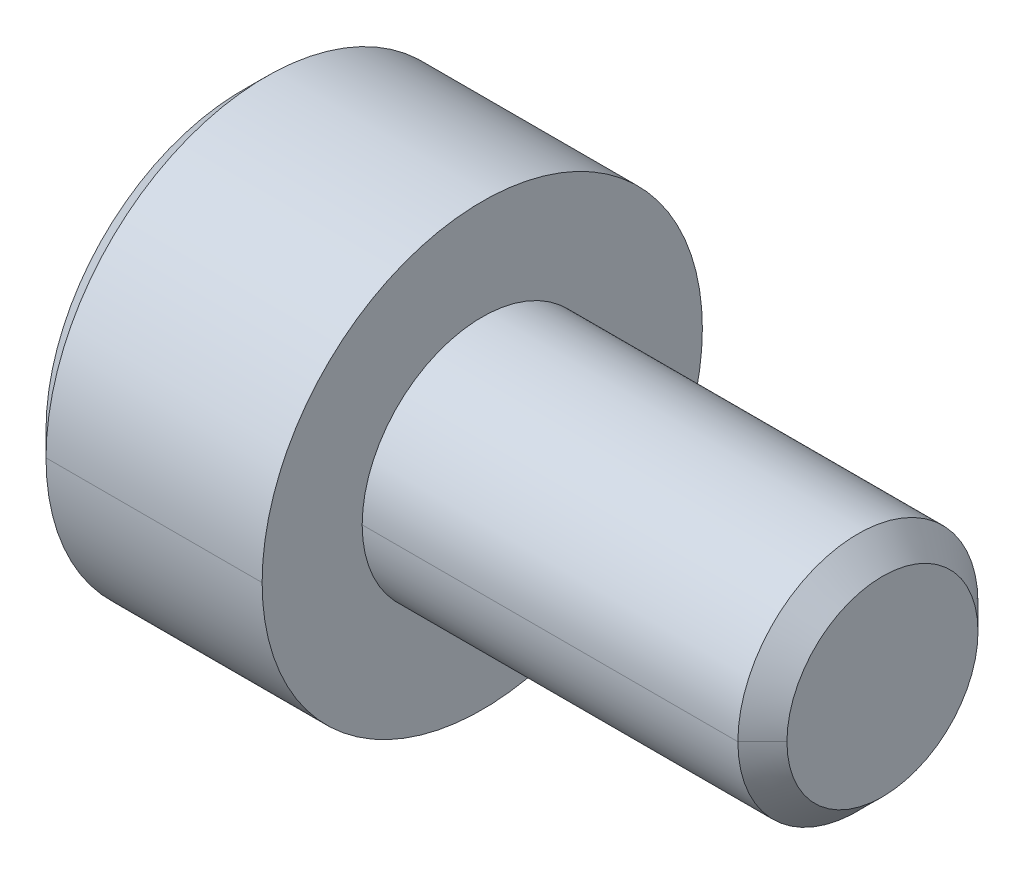
ISO-10303-21;
HEADER;
FILE_DESCRIPTION(('STEP AP214'),'2;1');
FILE_NAME('part.step','',(''),(''),'','','');
FILE_SCHEMA(('AUTOMOTIVE_DESIGN { 1 0 10303 214 1 1 1 1 }'));
ENDSEC;
DATA;
#1=APPLICATION_CONTEXT('core data for automotive mechanical design processes');
#2=APPLICATION_PROTOCOL_DEFINITION('international standard','automotive_design',2000,#1);
#3=PRODUCT_CONTEXT('',#1,'mechanical');
#4=PRODUCT('Part','Part','',(#3));
#5=PRODUCT_RELATED_PRODUCT_CATEGORY('part','',(#4));
#6=PRODUCT_DEFINITION_FORMATION('','',#4);
#7=PRODUCT_DEFINITION_CONTEXT('part definition',#1,'design');
#8=PRODUCT_DEFINITION('design','',#6,#7);
#9=PRODUCT_DEFINITION_SHAPE('','',#8);
#10=(LENGTH_UNIT() NAMED_UNIT(*) SI_UNIT(.MILLI.,.METRE.));
#11=(NAMED_UNIT(*) PLANE_ANGLE_UNIT() SI_UNIT($,.RADIAN.));
#12=(NAMED_UNIT(*) SI_UNIT($,.STERADIAN.) SOLID_ANGLE_UNIT());
#13=UNCERTAINTY_MEASURE_WITH_UNIT(LENGTH_MEASURE(1.E-05),#10,'distance_accuracy_value','');
#14=(GEOMETRIC_REPRESENTATION_CONTEXT(3) GLOBAL_UNCERTAINTY_ASSIGNED_CONTEXT((#13)) GLOBAL_UNIT_ASSIGNED_CONTEXT((#10,
#11,#12)) REPRESENTATION_CONTEXT('',''));
#15=CARTESIAN_POINT('',(0.,0.,0.));
#16=DIRECTION('',(0.,0.,1.));
#17=DIRECTION('',(1.,0.,0.));
#18=AXIS2_PLACEMENT_3D('',#15,#16,#17);
#19=CARTESIAN_POINT('',(-3.,0.,0.));
#20=DIRECTION('',(1.,0.,0.));
#21=DIRECTION('',(0.,0.,-1.));
#22=AXIS2_PLACEMENT_3D('',#19,#20,#21);
#23=PLANE('',#22);
#24=CARTESIAN_POINT('',(-3.,0.,0.));
#25=DIRECTION('',(1.,0.,0.));
#26=DIRECTION('',(0.,0.,-1.));
#27=AXIS2_PLACEMENT_3D('',#24,#25,#26);
#28=CIRCLE('',#27,2.45);
#29=CARTESIAN_POINT('',(-3.,0.,2.45));
#30=VERTEX_POINT('',#29);
#31=CARTESIAN_POINT('',(-3.,0.,-2.45));
#32=VERTEX_POINT('',#31);
#33=EDGE_CURVE('E11',#30,#32,#28,.T.);
#34=ORIENTED_EDGE('',*,*,#33,.F.);
#35=CARTESIAN_POINT('',(-3.,0.,0.));
#36=DIRECTION('',(1.,0.,0.));
#37=DIRECTION('',(0.,0.,-1.));
#38=AXIS2_PLACEMENT_3D('',#35,#36,#37);
#39=CIRCLE('',#38,2.45);
#40=EDGE_CURVE('E24',#32,#30,#39,.T.);
#41=ORIENTED_EDGE('',*,*,#40,.F.);
#42=EDGE_LOOP('',(#34,#41));
#43=FACE_BOUND('',#42,.T.);
#44=DIRECTION('',(0.,0.50000000000002,-0.866025403784427));
#45=VECTOR('',#44,1.);
#46=CARTESIAN_POINT('',(-3.,-1.4433756729741,0.));
#47=LINE('',#46,#45);
#48=CARTESIAN_POINT('',(-3.,-1.4433756729741,0.));
#49=VERTEX_POINT('',#48);
#50=CARTESIAN_POINT('',(-3.,-0.72168783648703,-1.25));
#51=VERTEX_POINT('',#50);
#52=EDGE_CURVE('E352',#49,#51,#47,.T.);
#53=ORIENTED_EDGE('',*,*,#52,.T.);
#54=DIRECTION('',(0.,1.,0.));
#55=VECTOR('',#54,1.);
#56=CARTESIAN_POINT('',(-3.,-0.72168783648703,-1.25));
#57=LINE('',#56,#55);
#58=CARTESIAN_POINT('',(-3.,0.72168783648703,-1.25));
#59=VERTEX_POINT('',#58);
#60=EDGE_CURVE('E348',#51,#59,#57,.T.);
#61=ORIENTED_EDGE('',*,*,#60,.T.);
#62=DIRECTION('',(0.,0.50000000000002,0.866025403784427));
#63=VECTOR('',#62,1.);
#64=CARTESIAN_POINT('',(-3.,0.72168783648703,-1.25));
#65=LINE('',#64,#63);
#66=CARTESIAN_POINT('',(-3.,1.4433756729741,0.));
#67=VERTEX_POINT('',#66);
#68=EDGE_CURVE('E344',#59,#67,#65,.T.);
#69=ORIENTED_EDGE('',*,*,#68,.T.);
#70=DIRECTION('',(0.,-0.50000000000002,0.866025403784427));
#71=VECTOR('',#70,1.);
#72=CARTESIAN_POINT('',(-3.,1.4433756729741,0.));
#73=LINE('',#72,#71);
#74=CARTESIAN_POINT('',(-3.,0.72168783648703,1.25));
#75=VERTEX_POINT('',#74);
#76=EDGE_CURVE('E340',#67,#75,#73,.T.);
#77=ORIENTED_EDGE('',*,*,#76,.T.);
#78=DIRECTION('',(0.,-1.,0.));
#79=VECTOR('',#78,1.);
#80=CARTESIAN_POINT('',(-3.,0.72168783648703,1.25));
#81=LINE('',#80,#79);
#82=CARTESIAN_POINT('',(-3.,-0.72168783648703,1.25));
#83=VERTEX_POINT('',#82);
#84=EDGE_CURVE('E336',#75,#83,#81,.T.);
#85=ORIENTED_EDGE('',*,*,#84,.T.);
#86=DIRECTION('',(0.,-0.50000000000002,-0.866025403784427));
#87=VECTOR('',#86,1.);
#88=CARTESIAN_POINT('',(-3.,-0.72168783648703,1.25));
#89=LINE('',#88,#87);
#90=EDGE_CURVE('E332',#83,#49,#89,.T.);
#91=ORIENTED_EDGE('',*,*,#90,.T.);
#92=EDGE_LOOP('',(#53,#61,#69,#77,#85,#91));
#93=FACE_BOUND('',#92,.T.);
#94=ADVANCED_FACE('F16',(#43,#93),#23,.F.);
#95=CARTESIAN_POINT('',(-1.5,-0.72168783648703,1.25));
#96=DIRECTION('',(0.,0.866025403784427,-0.50000000000002));
#97=DIRECTION('',(0.,0.50000000000002,0.866025403784427));
#98=AXIS2_PLACEMENT_3D('',#95,#96,#97);
#99=PLANE('',#98);
#100=ORIENTED_EDGE('',*,*,#90,.F.);
#101=DIRECTION('',(-1.,0.,0.));
#102=VECTOR('',#101,1.);
#103=CARTESIAN_POINT('',(-1.5,-0.72168783648703,1.25));
#104=LINE('',#103,#102);
#105=CARTESIAN_POINT('',(-1.5,-0.72168783648703,1.25));
#106=VERTEX_POINT('',#105);
#107=EDGE_CURVE('E327',#106,#83,#104,.T.);
#108=ORIENTED_EDGE('',*,*,#107,.F.);
#109=DIRECTION('',(0.,-0.50000000000002,-0.866025403784427));
#110=VECTOR('',#109,1.);
#111=CARTESIAN_POINT('',(-1.5,-0.72168783648703,1.25));
#112=LINE('',#111,#110);
#113=CARTESIAN_POINT('',(-1.5,-1.08253175473055,0.625000000000032));
#114=VERTEX_POINT('',#113);
#115=EDGE_CURVE('E323',#106,#114,#112,.T.);
#116=ORIENTED_EDGE('',*,*,#115,.T.);
#117=DIRECTION('',(0.,-0.50000000000002,-0.866025403784427));
#118=VECTOR('',#117,1.);
#119=CARTESIAN_POINT('',(-1.5,-0.72168783648703,1.25));
#120=LINE('',#119,#118);
#121=CARTESIAN_POINT('',(-1.5,-1.4433756729741,0.));
#122=VERTEX_POINT('',#121);
#123=EDGE_CURVE('E319',#114,#122,#120,.T.);
#124=ORIENTED_EDGE('',*,*,#123,.T.);
#125=DIRECTION('',(-1.,0.,0.));
#126=VECTOR('',#125,1.);
#127=CARTESIAN_POINT('',(-1.5,-1.4433756729741,0.));
#128=LINE('',#127,#126);
#129=EDGE_CURVE('E314',#122,#49,#128,.T.);
#130=ORIENTED_EDGE('',*,*,#129,.T.);
#131=EDGE_LOOP('',(#100,#108,#116,#124,#130));
#132=FACE_BOUND('',#131,.T.);
#133=ADVANCED_FACE('F386',(#132),#99,.T.);
#134=CARTESIAN_POINT('',(-1.5,-1.4433756729741,0.));
#135=DIRECTION('',(0.,0.866025403784427,0.50000000000002));
#136=DIRECTION('',(0.,-0.50000000000002,0.866025403784427));
#137=AXIS2_PLACEMENT_3D('',#134,#135,#136);
#138=PLANE('',#137);
#139=ORIENTED_EDGE('',*,*,#52,.F.);
#140=ORIENTED_EDGE('',*,*,#129,.F.);
#141=DIRECTION('',(0.,0.50000000000002,-0.866025403784427));
#142=VECTOR('',#141,1.);
#143=CARTESIAN_POINT('',(-1.5,-1.4433756729741,0.));
#144=LINE('',#143,#142);
#145=CARTESIAN_POINT('',(-1.5,-1.08253175473053,-0.625000000000024));
#146=VERTEX_POINT('',#145);
#147=EDGE_CURVE('E310',#122,#146,#144,.T.);
#148=ORIENTED_EDGE('',*,*,#147,.T.);
#149=DIRECTION('',(0.,0.50000000000002,-0.866025403784427));
#150=VECTOR('',#149,1.);
#151=CARTESIAN_POINT('',(-1.5,-1.4433756729741,0.));
#152=LINE('',#151,#150);
#153=CARTESIAN_POINT('',(-1.5,-0.72168783648703,-1.25));
#154=VERTEX_POINT('',#153);
#155=EDGE_CURVE('E306',#146,#154,#152,.T.);
#156=ORIENTED_EDGE('',*,*,#155,.T.);
#157=DIRECTION('',(-1.,0.,0.));
#158=VECTOR('',#157,1.);
#159=CARTESIAN_POINT('',(-1.5,-0.72168783648703,-1.25));
#160=LINE('',#159,#158);
#161=EDGE_CURVE('E301',#154,#51,#160,.T.);
#162=ORIENTED_EDGE('',*,*,#161,.T.);
#163=EDGE_LOOP('',(#139,#140,#148,#156,#162));
#164=FACE_BOUND('',#163,.T.);
#165=ADVANCED_FACE('F390',(#164),#138,.T.);
#166=CARTESIAN_POINT('',(-1.5,-0.72168783648703,-1.25));
#167=DIRECTION('',(0.,0.,1.));
#168=DIRECTION('',(1.,0.,0.));
#169=AXIS2_PLACEMENT_3D('',#166,#167,#168);
#170=PLANE('',#169);
#171=ORIENTED_EDGE('',*,*,#60,.F.);
#172=ORIENTED_EDGE('',*,*,#161,.F.);
#173=DIRECTION('',(0.,1.,0.));
#174=VECTOR('',#173,1.);
#175=CARTESIAN_POINT('',(-1.5,-0.72168783648703,-1.25));
#176=LINE('',#175,#174);
#177=CARTESIAN_POINT('',(-1.5,0.,-1.25));
#178=VERTEX_POINT('',#177);
#179=EDGE_CURVE('E297',#154,#178,#176,.T.);
#180=ORIENTED_EDGE('',*,*,#179,.T.);
#181=DIRECTION('',(0.,1.,0.));
#182=VECTOR('',#181,1.);
#183=CARTESIAN_POINT('',(-1.5,-0.72168783648703,-1.25));
#184=LINE('',#183,#182);
#185=CARTESIAN_POINT('',(-1.5,0.72168783648703,-1.25));
#186=VERTEX_POINT('',#185);
#187=EDGE_CURVE('E293',#178,#186,#184,.T.);
#188=ORIENTED_EDGE('',*,*,#187,.T.);
#189=DIRECTION('',(-1.,0.,0.));
#190=VECTOR('',#189,1.);
#191=CARTESIAN_POINT('',(-1.5,0.72168783648703,-1.25));
#192=LINE('',#191,#190);
#193=EDGE_CURVE('E288',#186,#59,#192,.T.);
#194=ORIENTED_EDGE('',*,*,#193,.T.);
#195=EDGE_LOOP('',(#171,#172,#180,#188,#194));
#196=FACE_BOUND('',#195,.T.);
#197=ADVANCED_FACE('F402',(#196),#170,.T.);
#198=CARTESIAN_POINT('',(-1.5,0.72168783648703,-1.25));
#199=DIRECTION('',(0.,-0.866025403784427,0.50000000000002));
#200=DIRECTION('',(0.,-0.50000000000002,-0.866025403784427));
#201=AXIS2_PLACEMENT_3D('',#198,#199,#200);
#202=PLANE('',#201);
#203=ORIENTED_EDGE('',*,*,#68,.F.);
#204=ORIENTED_EDGE('',*,*,#193,.F.);
#205=DIRECTION('',(0.,0.50000000000002,0.866025403784427));
#206=VECTOR('',#205,1.);
#207=CARTESIAN_POINT('',(-1.5,0.72168783648703,-1.25));
#208=LINE('',#207,#206);
#209=CARTESIAN_POINT('',(-1.5,1.08253175473055,-0.625000000000032));
#210=VERTEX_POINT('',#209);
#211=EDGE_CURVE('E284',#186,#210,#208,.T.);
#212=ORIENTED_EDGE('',*,*,#211,.T.);
#213=DIRECTION('',(0.,0.50000000000002,0.866025403784427));
#214=VECTOR('',#213,1.);
#215=CARTESIAN_POINT('',(-1.5,0.72168783648703,-1.25));
#216=LINE('',#215,#214);
#217=CARTESIAN_POINT('',(-1.5,1.4433756729741,0.));
#218=VERTEX_POINT('',#217);
#219=EDGE_CURVE('E280',#210,#218,#216,.T.);
#220=ORIENTED_EDGE('',*,*,#219,.T.);
#221=DIRECTION('',(-1.,0.,0.));
#222=VECTOR('',#221,1.);
#223=CARTESIAN_POINT('',(-1.5,1.4433756729741,0.));
#224=LINE('',#223,#222);
#225=EDGE_CURVE('E275',#218,#67,#224,.T.);
#226=ORIENTED_EDGE('',*,*,#225,.T.);
#227=EDGE_LOOP('',(#203,#204,#212,#220,#226));
#228=FACE_BOUND('',#227,.T.);
#229=ADVANCED_FACE('F408',(#228),#202,.T.);
#230=CARTESIAN_POINT('',(-1.5,1.4433756729741,0.));
#231=DIRECTION('',(0.,-0.866025403784427,-0.50000000000002));
#232=DIRECTION('',(0.,0.50000000000002,-0.866025403784427));
#233=AXIS2_PLACEMENT_3D('',#230,#231,#232);
#234=PLANE('',#233);
#235=ORIENTED_EDGE('',*,*,#76,.F.);
#236=ORIENTED_EDGE('',*,*,#225,.F.);
#237=DIRECTION('',(0.,-0.50000000000002,0.866025403784427));
#238=VECTOR('',#237,1.);
#239=CARTESIAN_POINT('',(-1.5,1.4433756729741,0.));
#240=LINE('',#239,#238);
#241=CARTESIAN_POINT('',(-1.5,1.08253175473055,0.625000000000032));
#242=VERTEX_POINT('',#241);
#243=EDGE_CURVE('E271',#218,#242,#240,.T.);
#244=ORIENTED_EDGE('',*,*,#243,.T.);
#245=DIRECTION('',(0.,-0.50000000000002,0.866025403784427));
#246=VECTOR('',#245,1.);
#247=CARTESIAN_POINT('',(-1.5,1.4433756729741,0.));
#248=LINE('',#247,#246);
#249=CARTESIAN_POINT('',(-1.5,0.72168783648703,1.25));
#250=VERTEX_POINT('',#249);
#251=EDGE_CURVE('E267',#242,#250,#248,.T.);
#252=ORIENTED_EDGE('',*,*,#251,.T.);
#253=DIRECTION('',(-1.,0.,0.));
#254=VECTOR('',#253,1.);
#255=CARTESIAN_POINT('',(-1.5,0.72168783648703,1.25));
#256=LINE('',#255,#254);
#257=EDGE_CURVE('E262',#250,#75,#256,.T.);
#258=ORIENTED_EDGE('',*,*,#257,.T.);
#259=EDGE_LOOP('',(#235,#236,#244,#252,#258));
#260=FACE_BOUND('',#259,.T.);
#261=ADVANCED_FACE('F414',(#260),#234,.T.);
#262=CARTESIAN_POINT('',(-1.5,0.72168783648703,1.25));
#263=DIRECTION('',(0.,0.,-1.));
#264=DIRECTION('',(-1.,0.,0.));
#265=AXIS2_PLACEMENT_3D('',#262,#263,#264);
#266=PLANE('',#265);
#267=ORIENTED_EDGE('',*,*,#84,.F.);
#268=ORIENTED_EDGE('',*,*,#257,.F.);
#269=DIRECTION('',(0.,-1.,0.));
#270=VECTOR('',#269,1.);
#271=CARTESIAN_POINT('',(-1.5,0.72168783648703,1.25));
#272=LINE('',#271,#270);
#273=CARTESIAN_POINT('',(-1.5,0.,1.25));
#274=VERTEX_POINT('',#273);
#275=EDGE_CURVE('E258',#250,#274,#272,.T.);
#276=ORIENTED_EDGE('',*,*,#275,.T.);
#277=DIRECTION('',(0.,-1.,0.));
#278=VECTOR('',#277,1.);
#279=CARTESIAN_POINT('',(-1.5,0.72168783648703,1.25));
#280=LINE('',#279,#278);
#281=EDGE_CURVE('E253',#274,#106,#280,.T.);
#282=ORIENTED_EDGE('',*,*,#281,.T.);
#283=ORIENTED_EDGE('',*,*,#107,.T.);
#284=EDGE_LOOP('',(#267,#268,#276,#282,#283));
#285=FACE_BOUND('',#284,.T.);
#286=ADVANCED_FACE('F418',(#285),#266,.T.);
#287=CARTESIAN_POINT('',(-1.5,0.,0.));
#288=DIRECTION('',(1.,0.,0.));
#289=DIRECTION('',(0.,0.,-1.));
#290=AXIS2_PLACEMENT_3D('',#287,#288,#289);
#291=PLANE('',#290);
#292=CARTESIAN_POINT('',(-1.5,0.,0.));
#293=DIRECTION('',(1.,0.,0.));
#294=DIRECTION('',(0.,0.,-1.));
#295=AXIS2_PLACEMENT_3D('',#292,#293,#294);
#296=CIRCLE('',#295,1.25);
#297=EDGE_CURVE('E248',#274,#114,#296,.T.);
#298=ORIENTED_EDGE('',*,*,#297,.T.);
#299=ORIENTED_EDGE('',*,*,#115,.F.);
#300=ORIENTED_EDGE('',*,*,#281,.F.);
#301=EDGE_LOOP('',(#298,#299,#300));
#302=FACE_BOUND('',#301,.T.);
#303=ADVANCED_FACE('F459',(#302),#291,.F.);
#304=CARTESIAN_POINT('',(-1.5,0.,0.));
#305=DIRECTION('',(-1.,0.,0.));
#306=DIRECTION('',(0.,1.,0.));
#307=AXIS2_PLACEMENT_3D('',#304,#305,#306);
#308=CONICAL_SURFACE('',#307,1.25,1.30899693899575);
#309=DIRECTION('',(-0.258819045102518,0.,-0.965925826289069));
#310=VECTOR('',#309,1.);
#311=CARTESIAN_POINT('',(-1.1650635094611,0.,0.));
#312=LINE('',#311,#310);
#313=CARTESIAN_POINT('',(-1.1650635094611,0.,0.));
#314=VERTEX_POINT('',#313);
#315=EDGE_CURVE('E243',#314,#178,#312,.T.);
#316=ORIENTED_EDGE('',*,*,#315,.T.);
#317=CARTESIAN_POINT('',(-1.5,0.,0.));
#318=DIRECTION('',(1.,0.,0.));
#319=DIRECTION('',(0.,0.,-1.));
#320=AXIS2_PLACEMENT_3D('',#317,#318,#319);
#321=CIRCLE('',#320,1.25);
#322=EDGE_CURVE('E238',#146,#178,#321,.T.);
#323=ORIENTED_EDGE('',*,*,#322,.F.);
#324=CARTESIAN_POINT('',(-1.5,0.,0.));
#325=DIRECTION('',(1.,0.,0.));
#326=DIRECTION('',(0.,0.,-1.));
#327=AXIS2_PLACEMENT_3D('',#324,#325,#326);
#328=CIRCLE('',#327,1.25);
#329=EDGE_CURVE('E233',#114,#146,#328,.T.);
#330=ORIENTED_EDGE('',*,*,#329,.F.);
#331=ORIENTED_EDGE('',*,*,#297,.F.);
#332=DIRECTION('',(-0.258819045102518,0.,0.965925826289069));
#333=VECTOR('',#332,1.);
#334=CARTESIAN_POINT('',(-1.1650635094611,0.,0.));
#335=LINE('',#334,#333);
#336=EDGE_CURVE('E228',#314,#274,#335,.T.);
#337=ORIENTED_EDGE('',*,*,#336,.F.);
#338=EDGE_LOOP('',(#316,#323,#330,#331,#337));
#339=FACE_BOUND('',#338,.T.);
#340=ADVANCED_FACE('F427',(#339),#308,.F.);
#341=CARTESIAN_POINT('',(-1.5,0.,0.));
#342=DIRECTION('',(-1.,0.,0.));
#343=DIRECTION('',(0.,-1.,0.));
#344=AXIS2_PLACEMENT_3D('',#341,#342,#343);
#345=CONICAL_SURFACE('',#344,1.25,1.30899693899575);
#346=ORIENTED_EDGE('',*,*,#336,.T.);
#347=CARTESIAN_POINT('',(-1.5,0.,0.));
#348=DIRECTION('',(1.,0.,0.));
#349=DIRECTION('',(0.,0.,-1.));
#350=AXIS2_PLACEMENT_3D('',#347,#348,#349);
#351=CIRCLE('',#350,1.25);
#352=EDGE_CURVE('E223',#242,#274,#351,.T.);
#353=ORIENTED_EDGE('',*,*,#352,.F.);
#354=CARTESIAN_POINT('',(-1.5,0.,0.));
#355=DIRECTION('',(1.,0.,0.));
#356=DIRECTION('',(0.,0.,-1.));
#357=AXIS2_PLACEMENT_3D('',#354,#355,#356);
#358=CIRCLE('',#357,1.25);
#359=EDGE_CURVE('E218',#210,#242,#358,.T.);
#360=ORIENTED_EDGE('',*,*,#359,.F.);
#361=CARTESIAN_POINT('',(-1.5,0.,0.));
#362=DIRECTION('',(1.,0.,0.));
#363=DIRECTION('',(0.,0.,-1.));
#364=AXIS2_PLACEMENT_3D('',#361,#362,#363);
#365=CIRCLE('',#364,1.25);
#366=EDGE_CURVE('E213',#178,#210,#365,.T.);
#367=ORIENTED_EDGE('',*,*,#366,.F.);
#368=ORIENTED_EDGE('',*,*,#315,.F.);
#369=EDGE_LOOP('',(#346,#353,#360,#367,#368));
#370=FACE_BOUND('',#369,.T.);
#371=ADVANCED_FACE('F452',(#370),#345,.F.);
#372=CARTESIAN_POINT('',(-1.5,0.,0.));
#373=DIRECTION('',(1.,0.,0.));
#374=DIRECTION('',(0.,0.,-1.));
#375=AXIS2_PLACEMENT_3D('',#372,#373,#374);
#376=PLANE('',#375);
#377=ORIENTED_EDGE('',*,*,#366,.T.);
#378=ORIENTED_EDGE('',*,*,#211,.F.);
#379=ORIENTED_EDGE('',*,*,#187,.F.);
#380=EDGE_LOOP('',(#377,#378,#379));
#381=FACE_BOUND('',#380,.T.);
#382=ADVANCED_FACE('F448',(#381),#376,.F.);
#383=CARTESIAN_POINT('',(-1.5,0.,0.));
#384=DIRECTION('',(1.,0.,0.));
#385=DIRECTION('',(0.,0.,-1.));
#386=AXIS2_PLACEMENT_3D('',#383,#384,#385);
#387=PLANE('',#386);
#388=ORIENTED_EDGE('',*,*,#219,.F.);
#389=ORIENTED_EDGE('',*,*,#359,.T.);
#390=ORIENTED_EDGE('',*,*,#243,.F.);
#391=EDGE_LOOP('',(#388,#389,#390));
#392=FACE_BOUND('',#391,.T.);
#393=ADVANCED_FACE('F441',(#392),#387,.F.);
#394=CARTESIAN_POINT('',(-1.5,0.,0.));
#395=DIRECTION('',(1.,0.,0.));
#396=DIRECTION('',(0.,0.,-1.));
#397=AXIS2_PLACEMENT_3D('',#394,#395,#396);
#398=PLANE('',#397);
#399=ORIENTED_EDGE('',*,*,#352,.T.);
#400=ORIENTED_EDGE('',*,*,#275,.F.);
#401=ORIENTED_EDGE('',*,*,#251,.F.);
#402=EDGE_LOOP('',(#399,#400,#401));
#403=FACE_BOUND('',#402,.T.);
#404=ADVANCED_FACE('F434',(#403),#398,.F.);
#405=CARTESIAN_POINT('',(-1.5,0.,0.));
#406=DIRECTION('',(1.,0.,0.));
#407=DIRECTION('',(0.,0.,-1.));
#408=AXIS2_PLACEMENT_3D('',#405,#406,#407);
#409=PLANE('',#408);
#410=ORIENTED_EDGE('',*,*,#329,.T.);
#411=ORIENTED_EDGE('',*,*,#147,.F.);
#412=ORIENTED_EDGE('',*,*,#123,.F.);
#413=EDGE_LOOP('',(#410,#411,#412));
#414=FACE_BOUND('',#413,.T.);
#415=ADVANCED_FACE('F432',(#414),#409,.F.);
#416=CARTESIAN_POINT('',(-1.5,0.,0.));
#417=DIRECTION('',(1.,0.,0.));
#418=DIRECTION('',(0.,0.,-1.));
#419=AXIS2_PLACEMENT_3D('',#416,#417,#418);
#420=PLANE('',#419);
#421=ORIENTED_EDGE('',*,*,#322,.T.);
#422=ORIENTED_EDGE('',*,*,#179,.F.);
#423=ORIENTED_EDGE('',*,*,#155,.F.);
#424=EDGE_LOOP('',(#421,#422,#423));
#425=FACE_BOUND('',#424,.T.);
#426=ADVANCED_FACE('F431',(#425),#420,.F.);
#427=CARTESIAN_POINT('',(-3.,0.,0.));
#428=DIRECTION('',(1.,0.,0.));
#429=DIRECTION('',(0.,-1.,0.));
#430=AXIS2_PLACEMENT_3D('',#427,#428,#429);
#431=CONICAL_SURFACE('',#430,2.45,0.785398163397448);
#432=DIRECTION('',(0.707106781186548,0.,0.707106781186547));
#433=VECTOR('',#432,1.);
#434=CARTESIAN_POINT('',(-3.,0.,2.45));
#435=LINE('',#434,#433);
#436=CARTESIAN_POINT('',(-2.7,0.,2.75));
#437=VERTEX_POINT('',#436);
#438=EDGE_CURVE('E209',#30,#437,#435,.T.);
#439=ORIENTED_EDGE('',*,*,#438,.T.);
#440=CARTESIAN_POINT('',(-2.7,0.,0.));
#441=DIRECTION('',(1.,0.,0.));
#442=DIRECTION('',(0.,0.,-1.));
#443=AXIS2_PLACEMENT_3D('',#440,#441,#442);
#444=CIRCLE('',#443,2.75);
#445=CARTESIAN_POINT('',(-2.7,0.,-2.75));
#446=VERTEX_POINT('',#445);
#447=EDGE_CURVE('E204',#446,#437,#444,.T.);
#448=ORIENTED_EDGE('',*,*,#447,.F.);
#449=DIRECTION('',(0.707106781186548,0.,-0.707106781186547));
#450=VECTOR('',#449,1.);
#451=CARTESIAN_POINT('',(-3.,0.,-2.45));
#452=LINE('',#451,#450);
#453=EDGE_CURVE('E199',#32,#446,#452,.T.);
#454=ORIENTED_EDGE('',*,*,#453,.F.);
#455=ORIENTED_EDGE('',*,*,#40,.T.);
#456=EDGE_LOOP('',(#439,#448,#454,#455));
#457=FACE_BOUND('',#456,.T.);
#458=ADVANCED_FACE('F361',(#457),#431,.T.);
#459=CARTESIAN_POINT('',(-3.,0.,0.));
#460=DIRECTION('',(1.,0.,0.));
#461=DIRECTION('',(0.,1.,0.));
#462=AXIS2_PLACEMENT_3D('',#459,#460,#461);
#463=CONICAL_SURFACE('',#462,2.45,0.785398163397448);
#464=ORIENTED_EDGE('',*,*,#438,.F.);
#465=ORIENTED_EDGE('',*,*,#33,.T.);
#466=ORIENTED_EDGE('',*,*,#453,.T.);
#467=CARTESIAN_POINT('',(-2.7,0.,0.));
#468=DIRECTION('',(1.,0.,0.));
#469=DIRECTION('',(0.,0.,-1.));
#470=AXIS2_PLACEMENT_3D('',#467,#468,#469);
#471=CIRCLE('',#470,2.75);
#472=EDGE_CURVE('E194',#437,#446,#471,.T.);
#473=ORIENTED_EDGE('',*,*,#472,.F.);
#474=EDGE_LOOP('',(#464,#465,#466,#473));
#475=FACE_BOUND('',#474,.T.);
#476=ADVANCED_FACE('F364',(#475),#463,.T.);
#477=CARTESIAN_POINT('',(5.,0.,0.));
#478=DIRECTION('',(1.,0.,0.));
#479=DIRECTION('',(0.,1.,0.));
#480=AXIS2_PLACEMENT_3D('',#477,#478,#479);
#481=CYLINDRICAL_SURFACE('',#480,2.75);
#482=DIRECTION('',(1.,0.,0.));
#483=VECTOR('',#482,1.);
#484=CARTESIAN_POINT('',(-2.7,0.,2.75));
#485=LINE('',#484,#483);
#486=CARTESIAN_POINT('',(0.,0.,2.75));
#487=VERTEX_POINT('',#486);
#488=EDGE_CURVE('E189',#437,#487,#485,.T.);
#489=ORIENTED_EDGE('',*,*,#488,.F.);
#490=ORIENTED_EDGE('',*,*,#472,.T.);
#491=DIRECTION('',(1.,0.,0.));
#492=VECTOR('',#491,1.);
#493=CARTESIAN_POINT('',(-2.7,0.,-2.75));
#494=LINE('',#493,#492);
#495=CARTESIAN_POINT('',(0.,0.,-2.75));
#496=VERTEX_POINT('',#495);
#497=EDGE_CURVE('E185',#446,#496,#494,.T.);
#498=ORIENTED_EDGE('',*,*,#497,.T.);
#499=CARTESIAN_POINT('',(0.,0.,0.));
#500=DIRECTION('',(1.,0.,0.));
#501=DIRECTION('',(0.,0.,-1.));
#502=AXIS2_PLACEMENT_3D('',#499,#500,#501);
#503=CIRCLE('',#502,2.75);
#504=EDGE_CURVE('E180',#487,#496,#503,.T.);
#505=ORIENTED_EDGE('',*,*,#504,.F.);
#506=EDGE_LOOP('',(#489,#490,#498,#505));
#507=FACE_BOUND('',#506,.T.);
#508=ADVANCED_FACE('F368',(#507),#481,.T.);
#509=CARTESIAN_POINT('',(0.,2.75,0.));
#510=DIRECTION('',(-1.,0.,0.));
#511=DIRECTION('',(0.,0.,1.));
#512=AXIS2_PLACEMENT_3D('',#509,#510,#511);
#513=PLANE('',#512);
#514=CARTESIAN_POINT('',(0.,0.,0.));
#515=DIRECTION('',(1.,0.,0.));
#516=DIRECTION('',(0.,0.,-1.));
#517=AXIS2_PLACEMENT_3D('',#514,#515,#516);
#518=CIRCLE('',#517,1.5);
#519=CARTESIAN_POINT('',(0.,0.,1.5));
#520=VERTEX_POINT('',#519);
#521=CARTESIAN_POINT('',(0.,0.,-1.5));
#522=VERTEX_POINT('',#521);
#523=EDGE_CURVE('E175',#520,#522,#518,.T.);
#524=ORIENTED_EDGE('',*,*,#523,.F.);
#525=CARTESIAN_POINT('',(0.,0.,0.));
#526=DIRECTION('',(1.,0.,0.));
#527=DIRECTION('',(0.,0.,-1.));
#528=AXIS2_PLACEMENT_3D('',#525,#526,#527);
#529=CIRCLE('',#528,1.5);
#530=EDGE_CURVE('E170',#522,#520,#529,.T.);
#531=ORIENTED_EDGE('',*,*,#530,.F.);
#532=EDGE_LOOP('',(#524,#531));
#533=FACE_BOUND('',#532,.T.);
#534=CARTESIAN_POINT('',(0.,0.,0.));
#535=DIRECTION('',(1.,0.,0.));
#536=DIRECTION('',(0.,0.,-1.));
#537=AXIS2_PLACEMENT_3D('',#534,#535,#536);
#538=CIRCLE('',#537,2.75);
#539=EDGE_CURVE('E165',#496,#487,#538,.T.);
#540=ORIENTED_EDGE('',*,*,#539,.T.);
#541=ORIENTED_EDGE('',*,*,#504,.T.);
#542=EDGE_LOOP('',(#540,#541));
#543=FACE_BOUND('',#542,.T.);
#544=ADVANCED_FACE('F373',(#533,#543),#513,.F.);
#545=CARTESIAN_POINT('',(5.,0.,0.));
#546=DIRECTION('',(1.,0.,0.));
#547=DIRECTION('',(0.,-1.,0.));
#548=AXIS2_PLACEMENT_3D('',#545,#546,#547);
#549=CYLINDRICAL_SURFACE('',#548,2.75);
#550=ORIENTED_EDGE('',*,*,#488,.T.);
#551=ORIENTED_EDGE('',*,*,#539,.F.);
#552=ORIENTED_EDGE('',*,*,#497,.F.);
#553=ORIENTED_EDGE('',*,*,#447,.T.);
#554=EDGE_LOOP('',(#550,#551,#552,#553));
#555=FACE_BOUND('',#554,.T.);
#556=ADVANCED_FACE('F371',(#555),#549,.T.);
#557=CARTESIAN_POINT('',(5.,0.,0.));
#558=DIRECTION('',(1.,0.,0.));
#559=DIRECTION('',(0.,-1.,0.));
#560=AXIS2_PLACEMENT_3D('',#557,#558,#559);
#561=CYLINDRICAL_SURFACE('',#560,1.5);
#562=DIRECTION('',(1.,0.,0.));
#563=VECTOR('',#562,1.);
#564=CARTESIAN_POINT('',(0.,0.,1.5));
#565=LINE('',#564,#563);
#566=CARTESIAN_POINT('',(4.6935,0.,1.5));
#567=VERTEX_POINT('',#566);
#568=EDGE_CURVE('E161',#520,#567,#565,.T.);
#569=ORIENTED_EDGE('',*,*,#568,.T.);
#570=CARTESIAN_POINT('',(4.6935,0.,0.));
#571=DIRECTION('',(1.,0.,0.));
#572=DIRECTION('',(0.,0.,-1.));
#573=AXIS2_PLACEMENT_3D('',#570,#571,#572);
#574=CIRCLE('',#573,1.5);
#575=CARTESIAN_POINT('',(4.6935,0.,-1.5));
#576=VERTEX_POINT('',#575);
#577=EDGE_CURVE('E139',#576,#567,#574,.T.);
#578=ORIENTED_EDGE('',*,*,#577,.F.);
#579=DIRECTION('',(1.,0.,0.));
#580=VECTOR('',#579,1.);
#581=CARTESIAN_POINT('',(0.,0.,-1.5));
#582=LINE('',#581,#580);
#583=EDGE_CURVE('E153',#522,#576,#582,.T.);
#584=ORIENTED_EDGE('',*,*,#583,.F.);
#585=ORIENTED_EDGE('',*,*,#530,.T.);
#586=EDGE_LOOP('',(#569,#578,#584,#585));
#587=FACE_BOUND('',#586,.T.);
#588=ADVANCED_FACE('F382',(#587),#561,.T.);
#589=CARTESIAN_POINT('',(5.,0.,0.));
#590=DIRECTION('',(1.,0.,0.));
#591=DIRECTION('',(0.,1.,0.));
#592=AXIS2_PLACEMENT_3D('',#589,#590,#591);
#593=CYLINDRICAL_SURFACE('',#592,1.5);
#594=ORIENTED_EDGE('',*,*,#568,.F.);
#595=ORIENTED_EDGE('',*,*,#523,.T.);
#596=ORIENTED_EDGE('',*,*,#583,.T.);
#597=CARTESIAN_POINT('',(4.6935,0.,0.));
#598=DIRECTION('',(1.,0.,0.));
#599=DIRECTION('',(0.,0.,-1.));
#600=AXIS2_PLACEMENT_3D('',#597,#598,#599);
#601=CIRCLE('',#600,1.5);
#602=EDGE_CURVE('E149',#567,#576,#601,.T.);
#603=ORIENTED_EDGE('',*,*,#602,.F.);
#604=EDGE_LOOP('',(#594,#595,#596,#603));
#605=FACE_BOUND('',#604,.T.);
#606=ADVANCED_FACE('F580',(#605),#593,.T.);
#607=CARTESIAN_POINT('',(4.6935,0.,0.));
#608=DIRECTION('',(-1.,0.,0.));
#609=DIRECTION('',(0.,1.,0.));
#610=AXIS2_PLACEMENT_3D('',#607,#608,#609);
#611=CONICAL_SURFACE('',#610,1.5,0.785398163397448);
#612=DIRECTION('',(-0.707106781186548,0.,-0.707106781186547));
#613=VECTOR('',#612,1.);
#614=CARTESIAN_POINT('',(5.,0.,-1.1935));
#615=LINE('',#614,#613);
#616=CARTESIAN_POINT('',(5.,0.,-1.1935));
#617=VERTEX_POINT('',#616);
#618=EDGE_CURVE('E130',#617,#576,#615,.T.);
#619=ORIENTED_EDGE('',*,*,#618,.F.);
#620=CARTESIAN_POINT('',(5.,0.,0.));
#621=DIRECTION('',(1.,0.,0.));
#622=DIRECTION('',(0.,0.,-1.));
#623=AXIS2_PLACEMENT_3D('',#620,#621,#622);
#624=CIRCLE('',#623,1.1935);
#625=CARTESIAN_POINT('',(5.,0.,1.1935));
#626=VERTEX_POINT('',#625);
#627=EDGE_CURVE('E122',#626,#617,#624,.T.);
#628=ORIENTED_EDGE('',*,*,#627,.F.);
#629=DIRECTION('',(-0.707106781186548,0.,0.707106781186547));
#630=VECTOR('',#629,1.);
#631=CARTESIAN_POINT('',(5.,0.,1.1935));
#632=LINE('',#631,#630);
#633=EDGE_CURVE('E127',#626,#567,#632,.T.);
#634=ORIENTED_EDGE('',*,*,#633,.T.);
#635=ORIENTED_EDGE('',*,*,#602,.T.);
#636=EDGE_LOOP('',(#619,#628,#634,#635));
#637=FACE_BOUND('',#636,.T.);
#638=ADVANCED_FACE('F124',(#637),#611,.T.);
#639=CARTESIAN_POINT('',(4.6935,0.,0.));
#640=DIRECTION('',(-1.,0.,0.));
#641=DIRECTION('',(0.,-1.,0.));
#642=AXIS2_PLACEMENT_3D('',#639,#640,#641);
#643=CONICAL_SURFACE('',#642,1.5,0.785398163397448);
#644=ORIENTED_EDGE('',*,*,#618,.T.);
#645=ORIENTED_EDGE('',*,*,#577,.T.);
#646=ORIENTED_EDGE('',*,*,#633,.F.);
#647=CARTESIAN_POINT('',(5.,0.,0.));
#648=DIRECTION('',(1.,0.,0.));
#649=DIRECTION('',(0.,0.,-1.));
#650=AXIS2_PLACEMENT_3D('',#647,#648,#649);
#651=CIRCLE('',#650,1.1935);
#652=EDGE_CURVE('E134',#617,#626,#651,.T.);
#653=ORIENTED_EDGE('',*,*,#652,.F.);
#654=EDGE_LOOP('',(#644,#645,#646,#653));
#655=FACE_BOUND('',#654,.T.);
#656=ADVANCED_FACE('F138',(#655),#643,.T.);
#657=CARTESIAN_POINT('',(5.,1.1935,0.));
#658=DIRECTION('',(-1.,0.,0.));
#659=DIRECTION('',(0.,0.,1.));
#660=AXIS2_PLACEMENT_3D('',#657,#658,#659);
#661=PLANE('',#660);
#662=ORIENTED_EDGE('',*,*,#652,.T.);
#663=ORIENTED_EDGE('',*,*,#627,.T.);
#664=EDGE_LOOP('',(#662,#663));
#665=FACE_BOUND('',#664,.T.);
#666=ADVANCED_FACE('F135',(#665),#661,.F.);
#667=CLOSED_SHELL('',(#94,#133,#165,#197,#229,#261,#286,#303,#340,#371,#382,#393,#404,#415,#426,
#458,#476,#508,#544,#556,#588,#606,#638,#656,#666));
#668=MANIFOLD_SOLID_BREP('B1',#667);
#669=ADVANCED_BREP_SHAPE_REPRESENTATION('',(#18,#668),#14);
#670=SHAPE_DEFINITION_REPRESENTATION(#9,#669);
ENDSEC;
END-ISO-10303-21;
